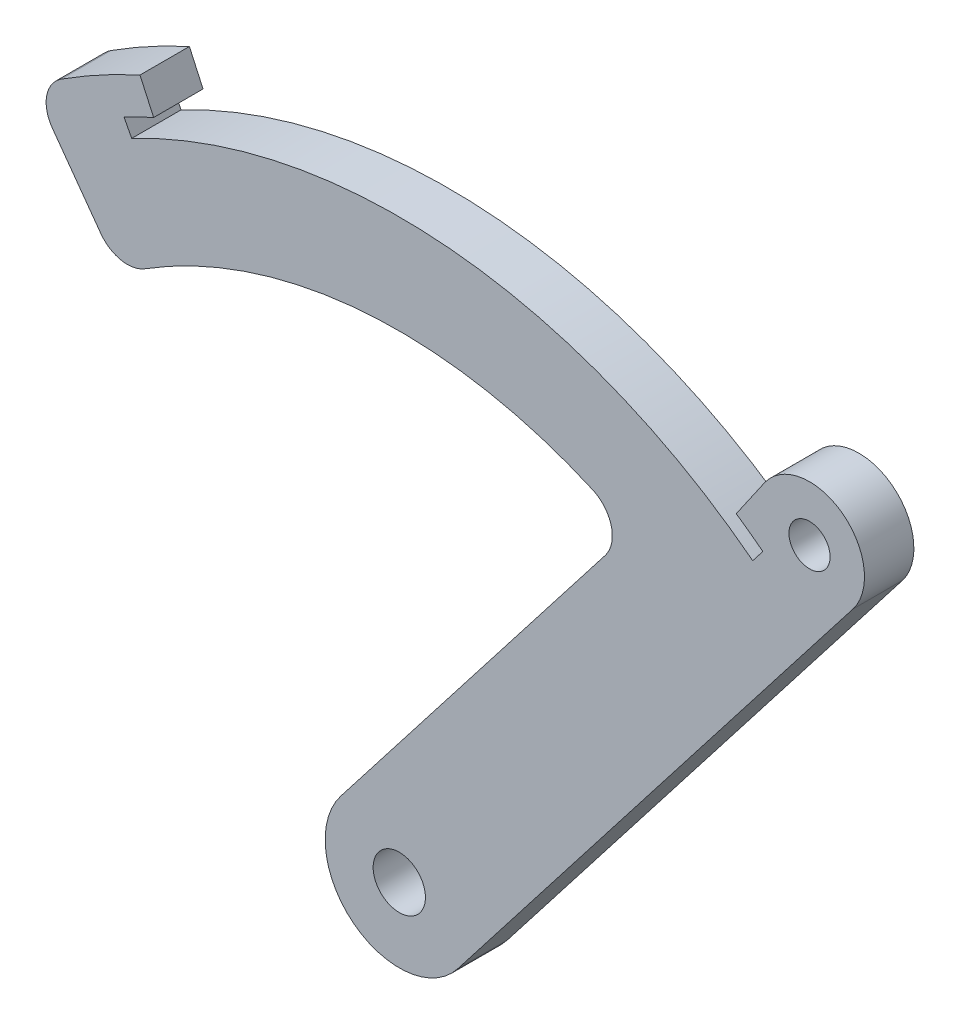
ISO-10303-21;
HEADER;
FILE_DESCRIPTION(('STEP AP214'),'2;1');
FILE_NAME('part.step','',(''),(''),'','','');
FILE_SCHEMA(('AUTOMOTIVE_DESIGN { 1 0 10303 214 1 1 1 1 }'));
ENDSEC;
DATA;
#1=APPLICATION_CONTEXT('core data for automotive mechanical design processes');
#2=APPLICATION_PROTOCOL_DEFINITION('international standard','automotive_design',2000,#1);
#3=PRODUCT_CONTEXT('',#1,'mechanical');
#4=PRODUCT('Part','Part','',(#3));
#5=PRODUCT_RELATED_PRODUCT_CATEGORY('part','',(#4));
#6=PRODUCT_DEFINITION_FORMATION('','',#4);
#7=PRODUCT_DEFINITION_CONTEXT('part definition',#1,'design');
#8=PRODUCT_DEFINITION('design','',#6,#7);
#9=PRODUCT_DEFINITION_SHAPE('','',#8);
#10=(LENGTH_UNIT() NAMED_UNIT(*) SI_UNIT(.MILLI.,.METRE.));
#11=(NAMED_UNIT(*) PLANE_ANGLE_UNIT() SI_UNIT($,.RADIAN.));
#12=(NAMED_UNIT(*) SI_UNIT($,.STERADIAN.) SOLID_ANGLE_UNIT());
#13=UNCERTAINTY_MEASURE_WITH_UNIT(LENGTH_MEASURE(1.E-05),#10,'distance_accuracy_value','');
#14=(GEOMETRIC_REPRESENTATION_CONTEXT(3) GLOBAL_UNCERTAINTY_ASSIGNED_CONTEXT((#13)) GLOBAL_UNIT_ASSIGNED_CONTEXT((#10,
#11,#12)) REPRESENTATION_CONTEXT('',''));
#15=CARTESIAN_POINT('',(0.,0.,0.));
#16=DIRECTION('',(0.,0.,1.));
#17=DIRECTION('',(1.,0.,0.));
#18=AXIS2_PLACEMENT_3D('',#15,#16,#17);
#19=CARTESIAN_POINT('',(-42.5000000000004,165.341310921622,-2.99999999999986));
#20=DIRECTION('',(0.,0.,1.));
#21=DIRECTION('',(1.,0.,0.));
#22=AXIS2_PLACEMENT_3D('',#19,#20,#21);
#23=CYLINDRICAL_SURFACE('',#22,35.);
#24=CARTESIAN_POINT('',(-42.5000000000004,165.341310921622,0.));
#25=DIRECTION('',(0.,0.,1.));
#26=DIRECTION('',(-1.,0.,0.));
#27=AXIS2_PLACEMENT_3D('',#24,#25,#26);
#28=CIRCLE('',#27,35.);
#29=CARTESIAN_POINT('',(-21.038388074973,192.989081420878,0.));
#30=VERTEX_POINT('',#29);
#31=CARTESIAN_POINT('',(-58.7480768092723,196.341310921622,0.));
#32=VERTEX_POINT('',#31);
#33=EDGE_CURVE('E182',#30,#32,#28,.T.);
#34=ORIENTED_EDGE('',*,*,#33,.F.);
#35=DIRECTION('',(0.,0.,1.));
#36=VECTOR('',#35,1.);
#37=CARTESIAN_POINT('',(-21.038388074973,192.989081420878,-2.99999999999986));
#38=LINE('',#37,#36);
#39=CARTESIAN_POINT('',(-21.038388074973,192.989081420878,-2.99999999999986));
#40=VERTEX_POINT('',#39);
#41=EDGE_CURVE('E11',#40,#30,#38,.T.);
#42=ORIENTED_EDGE('',*,*,#41,.F.);
#43=CARTESIAN_POINT('',(-42.5000000000004,165.341310921622,-2.99999999999986));
#44=DIRECTION('',(0.,0.,1.));
#45=DIRECTION('',(-1.,0.,0.));
#46=AXIS2_PLACEMENT_3D('',#43,#44,#45);
#47=CIRCLE('',#46,35.);
#48=CARTESIAN_POINT('',(-58.7480768092723,196.341310921622,-2.99999999999986));
#49=VERTEX_POINT('',#48);
#50=EDGE_CURVE('E230',#40,#49,#47,.T.);
#51=ORIENTED_EDGE('',*,*,#50,.T.);
#52=DIRECTION('',(0.,0.,1.));
#53=VECTOR('',#52,1.);
#54=CARTESIAN_POINT('',(-58.7480768092723,196.341310921622,-2.99999999999986));
#55=LINE('',#54,#53);
#56=EDGE_CURVE('E34',#49,#32,#55,.T.);
#57=ORIENTED_EDGE('',*,*,#56,.T.);
#58=EDGE_LOOP('',(#34,#42,#51,#57));
#59=FACE_BOUND('',#58,.T.);
#60=ADVANCED_FACE('F31',(#59),#23,.T.);
#61=CARTESIAN_POINT('',(-21.038388074973,192.989081420878,-2.99999999999986));
#62=DIRECTION('',(-0.78993629997874,0.613188912143638,0.));
#63=DIRECTION('',(-0.613188912143638,-0.78993629997874,0.));
#64=AXIS2_PLACEMENT_3D('',#61,#62,#63);
#65=PLANE('',#64);
#66=DIRECTION('',(-0.613188912143638,-0.78993629997874,0.));
#67=VECTOR('',#66,1.);
#68=CARTESIAN_POINT('',(-21.038388074973,192.989081420878,0.));
#69=LINE('',#68,#67);
#70=CARTESIAN_POINT('',(-20.4251991628294,193.779017720856,0.));
#71=VERTEX_POINT('',#70);
#72=EDGE_CURVE('E228',#71,#30,#69,.T.);
#73=ORIENTED_EDGE('',*,*,#72,.F.);
#74=DIRECTION('',(0.,0.,1.));
#75=VECTOR('',#74,1.);
#76=CARTESIAN_POINT('',(-20.4251991628294,193.779017720856,-2.99999999999986));
#77=LINE('',#76,#75);
#78=CARTESIAN_POINT('',(-20.4251991628294,193.779017720856,-2.99999999999986));
#79=VERTEX_POINT('',#78);
#80=EDGE_CURVE('E40',#79,#71,#77,.T.);
#81=ORIENTED_EDGE('',*,*,#80,.F.);
#82=DIRECTION('',(-0.613188912143638,-0.78993629997874,0.));
#83=VECTOR('',#82,1.);
#84=CARTESIAN_POINT('',(-21.038388074973,192.989081420878,-2.99999999999986));
#85=LINE('',#84,#83);
#86=EDGE_CURVE('E172',#79,#40,#85,.T.);
#87=ORIENTED_EDGE('',*,*,#86,.T.);
#88=ORIENTED_EDGE('',*,*,#41,.T.);
#89=EDGE_LOOP('',(#73,#81,#87,#88));
#90=FACE_BOUND('',#89,.T.);
#91=ADVANCED_FACE('F260',(#90),#65,.T.);
#92=CARTESIAN_POINT('',(-42.5000000000004,165.341310921622,-2.99999999999986));
#93=DIRECTION('',(0.,0.,1.));
#94=DIRECTION('',(1.,0.,0.));
#95=AXIS2_PLACEMENT_3D('',#92,#93,#94);
#96=CYLINDRICAL_SURFACE('',#95,36.);
#97=CARTESIAN_POINT('',(-42.5000000000004,165.341310921622,0.));
#98=DIRECTION('',(0.,0.,-1.));
#99=DIRECTION('',(1.,0.,0.));
#100=AXIS2_PLACEMENT_3D('',#97,#98,#99);
#101=CIRCLE('',#100,36.);
#102=CARTESIAN_POINT('',(-22.0385281770893,194.961036964248,0.));
#103=VERTEX_POINT('',#102);
#104=EDGE_CURVE('E159',#103,#71,#101,.T.);
#105=ORIENTED_EDGE('',*,*,#104,.F.);
#106=DIRECTION('',(0.,0.,1.));
#107=VECTOR('',#106,1.);
#108=CARTESIAN_POINT('',(-22.0385281770893,194.961036964248,-2.99999999999986));
#109=LINE('',#108,#107);
#110=CARTESIAN_POINT('',(-22.0385281770893,194.961036964248,-2.99999999999986));
#111=VERTEX_POINT('',#110);
#112=EDGE_CURVE('E154',#111,#103,#109,.T.);
#113=ORIENTED_EDGE('',*,*,#112,.F.);
#114=CARTESIAN_POINT('',(-42.5000000000004,165.341310921622,-2.99999999999986));
#115=DIRECTION('',(0.,0.,-1.));
#116=DIRECTION('',(1.,0.,0.));
#117=AXIS2_PLACEMENT_3D('',#114,#115,#116);
#118=CIRCLE('',#117,36.);
#119=EDGE_CURVE('E157',#111,#79,#118,.T.);
#120=ORIENTED_EDGE('',*,*,#119,.T.);
#121=ORIENTED_EDGE('',*,*,#80,.T.);
#122=EDGE_LOOP('',(#105,#113,#120,#121));
#123=FACE_BOUND('',#122,.T.);
#124=ADVANCED_FACE('F156',(#123),#96,.F.);
#125=CARTESIAN_POINT('',(-22.0385281770893,194.961036964248,-2.99999999999986));
#126=DIRECTION('',(-0.822770167850722,0.568374217303086,0.));
#127=DIRECTION('',(-0.568374217303086,-0.822770167850722,0.));
#128=AXIS2_PLACEMENT_3D('',#125,#126,#127);
#129=PLANE('',#128);
#130=DIRECTION('',(-0.568374217303086,-0.822770167850722,0.));
#131=VECTOR('',#130,1.);
#132=CARTESIAN_POINT('',(-22.0385281770893,194.961036964248,0.));
#133=LINE('',#132,#131);
#134=CARTESIAN_POINT('',(-20.33340552518,197.4293474678,0.));
#135=VERTEX_POINT('',#134);
#136=EDGE_CURVE('E225',#135,#103,#133,.T.);
#137=ORIENTED_EDGE('',*,*,#136,.F.);
#138=DIRECTION('',(0.,0.,1.));
#139=VECTOR('',#138,1.);
#140=CARTESIAN_POINT('',(-20.33340552518,197.4293474678,-2.99999999999986));
#141=LINE('',#140,#139);
#142=CARTESIAN_POINT('',(-20.33340552518,197.4293474678,-2.99999999999986));
#143=VERTEX_POINT('',#142);
#144=EDGE_CURVE('E164',#143,#135,#141,.T.);
#145=ORIENTED_EDGE('',*,*,#144,.F.);
#146=DIRECTION('',(-0.568374217303086,-0.822770167850722,0.));
#147=VECTOR('',#146,1.);
#148=CARTESIAN_POINT('',(-22.0385281770893,194.961036964248,-2.99999999999986));
#149=LINE('',#148,#147);
#150=EDGE_CURVE('E170',#143,#111,#149,.T.);
#151=ORIENTED_EDGE('',*,*,#150,.T.);
#152=ORIENTED_EDGE('',*,*,#112,.T.);
#153=EDGE_LOOP('',(#137,#145,#151,#152));
#154=FACE_BOUND('',#153,.T.);
#155=ADVANCED_FACE('F174',(#154),#129,.T.);
#156=CARTESIAN_POINT('',(-17.5890646974287,195.533541529599,-2.99999999999986));
#157=DIRECTION('',(0.,0.,1.));
#158=DIRECTION('',(1.,0.,0.));
#159=AXIS2_PLACEMENT_3D('',#156,#157,#158);
#160=CYLINDRICAL_SURFACE('',#159,3.33548897977206);
#161=CARTESIAN_POINT('',(-17.5890646974287,195.533541529599,0.));
#162=DIRECTION('',(0.,0.,1.));
#163=DIRECTION('',(1.,0.,0.));
#164=AXIS2_PLACEMENT_3D('',#161,#162,#163);
#165=CIRCLE('',#164,3.33548897977206);
#166=CARTESIAN_POINT('',(-14.9542408741277,193.488256670625,0.));
#167=VERTEX_POINT('',#166);
#168=EDGE_CURVE('E222',#167,#135,#165,.T.);
#169=ORIENTED_EDGE('',*,*,#168,.F.);
#170=DIRECTION('',(0.,0.,1.));
#171=VECTOR('',#170,1.);
#172=CARTESIAN_POINT('',(-14.9542408741277,193.488256670625,-2.99999999999986));
#173=LINE('',#172,#171);
#174=CARTESIAN_POINT('',(-14.9542408741277,193.488256670625,-2.99999999999986));
#175=VERTEX_POINT('',#174);
#176=EDGE_CURVE('E234',#175,#167,#173,.T.);
#177=ORIENTED_EDGE('',*,*,#176,.F.);
#178=CARTESIAN_POINT('',(-17.5890646974287,195.533541529599,-2.99999999999986));
#179=DIRECTION('',(0.,0.,1.));
#180=DIRECTION('',(1.,0.,0.));
#181=AXIS2_PLACEMENT_3D('',#178,#179,#180);
#182=CIRCLE('',#181,3.33548897977206);
#183=EDGE_CURVE('E175',#175,#143,#182,.T.);
#184=ORIENTED_EDGE('',*,*,#183,.T.);
#185=ORIENTED_EDGE('',*,*,#144,.T.);
#186=EDGE_LOOP('',(#169,#177,#184,#185));
#187=FACE_BOUND('',#186,.T.);
#188=ADVANCED_FACE('F273',(#187),#160,.T.);
#189=CARTESIAN_POINT('',(-14.9542408741277,193.488256670625,-2.99999999999986));
#190=DIRECTION('',(0.78993629997874,-0.613188912143639,0.));
#191=DIRECTION('',(0.613188912143638,0.789936299978739,0.));
#192=AXIS2_PLACEMENT_3D('',#189,#190,#191);
#193=PLANE('',#192);
#194=DIRECTION('',(0.613188912143638,0.789936299978739,0.));
#195=VECTOR('',#194,1.);
#196=CARTESIAN_POINT('',(-14.9542408741277,193.488256670625,0.));
#197=LINE('',#196,#195);
#198=CARTESIAN_POINT('',(-38.9452866500961,162.581960816975,0.));
#199=VERTEX_POINT('',#198);
#200=EDGE_CURVE('E219',#199,#167,#197,.T.);
#201=ORIENTED_EDGE('',*,*,#200,.F.);
#202=DIRECTION('',(0.,0.,1.));
#203=VECTOR('',#202,1.);
#204=CARTESIAN_POINT('',(-38.9452866500961,162.581960816975,-2.99999999999986));
#205=LINE('',#204,#203);
#206=CARTESIAN_POINT('',(-38.9452866500961,162.581960816975,-2.99999999999986));
#207=VERTEX_POINT('',#206);
#208=EDGE_CURVE('E236',#207,#199,#205,.T.);
#209=ORIENTED_EDGE('',*,*,#208,.F.);
#210=DIRECTION('',(0.613188912143638,0.789936299978739,0.));
#211=VECTOR('',#210,1.);
#212=CARTESIAN_POINT('',(-14.9542408741277,193.488256670625,-2.99999999999986));
#213=LINE('',#212,#211);
#214=EDGE_CURVE('E177',#207,#175,#213,.T.);
#215=ORIENTED_EDGE('',*,*,#214,.T.);
#216=ORIENTED_EDGE('',*,*,#176,.T.);
#217=EDGE_LOOP('',(#201,#209,#215,#216));
#218=FACE_BOUND('',#217,.T.);
#219=ADVANCED_FACE('F276',(#218),#193,.T.);
#220=CARTESIAN_POINT('',(-42.5000000000004,165.341310921622,-2.99999999999986));
#221=DIRECTION('',(0.,0.,1.));
#222=DIRECTION('',(1.,0.,0.));
#223=AXIS2_PLACEMENT_3D('',#220,#221,#222);
#224=CYLINDRICAL_SURFACE('',#223,4.49999999999999);
#225=CARTESIAN_POINT('',(-42.5000000000004,165.341310921622,0.));
#226=DIRECTION('',(0.,0.,1.));
#227=DIRECTION('',(-1.,0.,0.));
#228=AXIS2_PLACEMENT_3D('',#225,#226,#227);
#229=CIRCLE('',#228,4.49999999999999);
#230=CARTESIAN_POINT('',(-46.0547133499047,168.100661026268,0.));
#231=VERTEX_POINT('',#230);
#232=EDGE_CURVE('E216',#231,#199,#229,.T.);
#233=ORIENTED_EDGE('',*,*,#232,.F.);
#234=DIRECTION('',(0.,0.,1.));
#235=VECTOR('',#234,1.);
#236=CARTESIAN_POINT('',(-46.0547133499047,168.100661026268,-2.99999999999986));
#237=LINE('',#236,#235);
#238=CARTESIAN_POINT('',(-46.0547133499047,168.100661026268,-2.99999999999986));
#239=VERTEX_POINT('',#238);
#240=EDGE_CURVE('E238',#239,#231,#237,.T.);
#241=ORIENTED_EDGE('',*,*,#240,.F.);
#242=CARTESIAN_POINT('',(-42.5000000000004,165.341310921622,-2.99999999999986));
#243=DIRECTION('',(0.,0.,1.));
#244=DIRECTION('',(-1.,0.,0.));
#245=AXIS2_PLACEMENT_3D('',#242,#243,#244);
#246=CIRCLE('',#245,4.49999999999999);
#247=EDGE_CURVE('E385',#239,#207,#246,.T.);
#248=ORIENTED_EDGE('',*,*,#247,.T.);
#249=ORIENTED_EDGE('',*,*,#208,.T.);
#250=EDGE_LOOP('',(#233,#241,#248,#249));
#251=FACE_BOUND('',#250,.T.);
#252=ADVANCED_FACE('F280',(#251),#224,.T.);
#253=CARTESIAN_POINT('',(-46.0547133499047,168.100661026268,-2.99999999999986));
#254=DIRECTION('',(-0.78993629997874,0.613188912143638,0.));
#255=DIRECTION('',(-0.613188912143638,-0.78993629997874,0.));
#256=AXIS2_PLACEMENT_3D('',#253,#254,#255);
#257=PLANE('',#256);
#258=DIRECTION('',(-0.613188912143638,-0.78993629997874,0.));
#259=VECTOR('',#258,1.);
#260=CARTESIAN_POINT('',(-46.0547133499047,168.100661026268,0.));
#261=LINE('',#260,#259);
#262=CARTESIAN_POINT('',(-29.9855366168873,188.801664845481,0.));
#263=VERTEX_POINT('',#262);
#264=EDGE_CURVE('E213',#263,#231,#261,.T.);
#265=ORIENTED_EDGE('',*,*,#264,.F.);
#266=DIRECTION('',(0.,0.,1.));
#267=VECTOR('',#266,1.);
#268=CARTESIAN_POINT('',(-29.9855366168873,188.801664845481,-2.99999999999986));
#269=LINE('',#268,#267);
#270=CARTESIAN_POINT('',(-29.9855366168873,188.801664845481,-2.99999999999986));
#271=VERTEX_POINT('',#270);
#272=EDGE_CURVE('E240',#271,#263,#269,.T.);
#273=ORIENTED_EDGE('',*,*,#272,.F.);
#274=DIRECTION('',(-0.613188912143638,-0.78993629997874,0.));
#275=VECTOR('',#274,1.);
#276=CARTESIAN_POINT('',(-46.0547133499047,168.100661026268,-2.99999999999986));
#277=LINE('',#276,#275);
#278=EDGE_CURVE('E382',#271,#239,#277,.T.);
#279=ORIENTED_EDGE('',*,*,#278,.T.);
#280=ORIENTED_EDGE('',*,*,#240,.T.);
#281=EDGE_LOOP('',(#265,#273,#279,#280));
#282=FACE_BOUND('',#281,.T.);
#283=ADVANCED_FACE('F284',(#282),#257,.T.);
#284=CARTESIAN_POINT('',(-31.5654092168448,190.028042669768,-2.99999999999986));
#285=DIRECTION('',(0.,0.,1.));
#286=DIRECTION('',(1.,0.,0.));
#287=AXIS2_PLACEMENT_3D('',#284,#285,#286);
#288=CYLINDRICAL_SURFACE('',#287,2.);
#289=CARTESIAN_POINT('',(-31.5654092168448,190.028042669768,0.));
#290=DIRECTION('',(0.,0.,-1.));
#291=DIRECTION('',(1.,0.,0.));
#292=AXIS2_PLACEMENT_3D('',#289,#290,#291);
#293=CIRCLE('',#292,2.);
#294=CARTESIAN_POINT('',(-30.7554395292036,191.856689465927,0.));
#295=VERTEX_POINT('',#294);
#296=EDGE_CURVE('E210',#295,#263,#293,.T.);
#297=ORIENTED_EDGE('',*,*,#296,.F.);
#298=DIRECTION('',(0.,0.,1.));
#299=VECTOR('',#298,1.);
#300=CARTESIAN_POINT('',(-30.7554395292036,191.856689465927,-2.99999999999986));
#301=LINE('',#300,#299);
#302=CARTESIAN_POINT('',(-30.7554395292036,191.856689465927,-2.99999999999986));
#303=VERTEX_POINT('',#302);
#304=EDGE_CURVE('E242',#303,#295,#301,.T.);
#305=ORIENTED_EDGE('',*,*,#304,.F.);
#306=CARTESIAN_POINT('',(-31.5654092168448,190.028042669768,-2.99999999999986));
#307=DIRECTION('',(0.,0.,-1.));
#308=DIRECTION('',(1.,0.,0.));
#309=AXIS2_PLACEMENT_3D('',#306,#307,#308);
#310=CIRCLE('',#309,2.);
#311=EDGE_CURVE('E379',#303,#271,#310,.T.);
#312=ORIENTED_EDGE('',*,*,#311,.T.);
#313=ORIENTED_EDGE('',*,*,#272,.T.);
#314=EDGE_LOOP('',(#297,#305,#312,#313));
#315=FACE_BOUND('',#314,.T.);
#316=ADVANCED_FACE('F288',(#315),#288,.F.);
#317=CARTESIAN_POINT('',(-42.5000000000004,165.341310921622,-2.99999999999986));
#318=DIRECTION('',(0.,0.,1.));
#319=DIRECTION('',(1.,0.,0.));
#320=AXIS2_PLACEMENT_3D('',#317,#318,#319);
#321=CYLINDRICAL_SURFACE('',#320,29.);
#322=CARTESIAN_POINT('',(-42.5000000000004,165.341310921622,0.));
#323=DIRECTION('',(0.,0.,-1.));
#324=DIRECTION('',(1.,0.,0.));
#325=AXIS2_PLACEMENT_3D('',#322,#323,#324);
#326=CIRCLE('',#325,29.);
#327=CARTESIAN_POINT('',(-57.9425272657947,189.887763855706,0.));
#328=VERTEX_POINT('',#327);
#329=EDGE_CURVE('E207',#328,#295,#326,.T.);
#330=ORIENTED_EDGE('',*,*,#329,.F.);
#331=DIRECTION('',(0.,0.,1.));
#332=VECTOR('',#331,1.);
#333=CARTESIAN_POINT('',(-57.9425272657947,189.887763855706,-2.99999999999986));
#334=LINE('',#333,#332);
#335=CARTESIAN_POINT('',(-57.9425272657947,189.887763855706,-2.99999999999986));
#336=VERTEX_POINT('',#335);
#337=EDGE_CURVE('E244',#336,#328,#334,.T.);
#338=ORIENTED_EDGE('',*,*,#337,.F.);
#339=CARTESIAN_POINT('',(-42.5000000000004,165.341310921622,-2.99999999999986));
#340=DIRECTION('',(0.,0.,-1.));
#341=DIRECTION('',(1.,0.,0.));
#342=AXIS2_PLACEMENT_3D('',#339,#340,#341);
#343=CIRCLE('',#342,29.);
#344=EDGE_CURVE('E376',#336,#303,#343,.T.);
#345=ORIENTED_EDGE('',*,*,#344,.T.);
#346=ORIENTED_EDGE('',*,*,#304,.T.);
#347=EDGE_LOOP('',(#330,#338,#345,#346));
#348=FACE_BOUND('',#347,.T.);
#349=ADVANCED_FACE('F292',(#348),#321,.F.);
#350=CARTESIAN_POINT('',(-59.0075291461943,191.580622678746,-2.99999999999986));
#351=DIRECTION('',(0.,0.,1.));
#352=DIRECTION('',(1.,0.,0.));
#353=AXIS2_PLACEMENT_3D('',#350,#351,#352);
#354=CYLINDRICAL_SURFACE('',#353,2.);
#355=CARTESIAN_POINT('',(-59.0075291461943,191.580622678746,0.));
#356=DIRECTION('',(0.,0.,1.));
#357=DIRECTION('',(1.,0.,0.));
#358=AXIS2_PLACEMENT_3D('',#355,#356,#357);
#359=CIRCLE('',#358,2.);
#360=CARTESIAN_POINT('',(-60.6281513774536,190.408622856413,0.));
#361=VERTEX_POINT('',#360);
#362=EDGE_CURVE('E204',#361,#328,#359,.T.);
#363=ORIENTED_EDGE('',*,*,#362,.F.);
#364=DIRECTION('',(0.,0.,1.));
#365=VECTOR('',#364,1.);
#366=CARTESIAN_POINT('',(-60.6281513774536,190.408622856413,-2.99999999999986));
#367=LINE('',#366,#365);
#368=CARTESIAN_POINT('',(-60.6281513774536,190.408622856413,-2.99999999999986));
#369=VERTEX_POINT('',#368);
#370=EDGE_CURVE('E246',#369,#361,#367,.T.);
#371=ORIENTED_EDGE('',*,*,#370,.F.);
#372=CARTESIAN_POINT('',(-59.0075291461943,191.580622678746,-2.99999999999986));
#373=DIRECTION('',(0.,0.,1.));
#374=DIRECTION('',(1.,0.,0.));
#375=AXIS2_PLACEMENT_3D('',#372,#373,#374);
#376=CIRCLE('',#375,2.);
#377=EDGE_CURVE('E373',#369,#336,#376,.T.);
#378=ORIENTED_EDGE('',*,*,#377,.T.);
#379=ORIENTED_EDGE('',*,*,#337,.T.);
#380=EDGE_LOOP('',(#363,#371,#378,#379));
#381=FACE_BOUND('',#380,.T.);
#382=ADVANCED_FACE('F296',(#381),#354,.T.);
#383=CARTESIAN_POINT('',(-63.5634160925056,194.467459010821,-2.99999999999986));
#384=DIRECTION('',(-0.810311115629668,-0.585999911166377,0.));
#385=DIRECTION('',(0.585999911166377,-0.810311115629669,0.));
#386=AXIS2_PLACEMENT_3D('',#383,#384,#385);
#387=PLANE('',#386);
#388=DIRECTION('',(0.585999911166377,-0.810311115629669,0.));
#389=VECTOR('',#388,1.);
#390=CARTESIAN_POINT('',(-63.5634160925056,194.467459010821,0.));
#391=LINE('',#390,#389);
#392=CARTESIAN_POINT('',(-63.5634160925056,194.467459010821,0.));
#393=VERTEX_POINT('',#392);
#394=EDGE_CURVE('E201',#393,#361,#391,.T.);
#395=ORIENTED_EDGE('',*,*,#394,.F.);
#396=DIRECTION('',(0.,0.,1.));
#397=VECTOR('',#396,1.);
#398=CARTESIAN_POINT('',(-63.5634160925056,194.467459010821,-2.99999999999986));
#399=LINE('',#398,#397);
#400=CARTESIAN_POINT('',(-63.5634160925056,194.467459010821,-2.99999999999986));
#401=VERTEX_POINT('',#400);
#402=EDGE_CURVE('E248',#401,#393,#399,.T.);
#403=ORIENTED_EDGE('',*,*,#402,.F.);
#404=DIRECTION('',(0.585999911166377,-0.810311115629669,0.));
#405=VECTOR('',#404,1.);
#406=CARTESIAN_POINT('',(-63.5634160925056,194.467459010821,-2.99999999999986));
#407=LINE('',#406,#405);
#408=EDGE_CURVE('E370',#401,#369,#407,.T.);
#409=ORIENTED_EDGE('',*,*,#408,.T.);
#410=ORIENTED_EDGE('',*,*,#370,.T.);
#411=EDGE_LOOP('',(#395,#403,#409,#410));
#412=FACE_BOUND('',#411,.T.);
#413=ADVANCED_FACE('F300',(#412),#387,.T.);
#414=CARTESIAN_POINT('',(-61.9427938612462,195.639458833154,-2.99999999999986));
#415=DIRECTION('',(0.,0.,1.));
#416=DIRECTION('',(1.,0.,0.));
#417=AXIS2_PLACEMENT_3D('',#414,#415,#416);
#418=CYLINDRICAL_SURFACE('',#417,2.00000000000001);
#419=CARTESIAN_POINT('',(-61.9427938612462,195.639458833154,0.));
#420=DIRECTION('',(0.,0.,1.));
#421=DIRECTION('',(-1.,0.,0.));
#422=AXIS2_PLACEMENT_3D('',#419,#420,#421);
#423=CIRCLE('',#422,2.00000000000001);
#424=CARTESIAN_POINT('',(-63.0229490757599,197.322689272684,0.));
#425=VERTEX_POINT('',#424);
#426=EDGE_CURVE('E198',#425,#393,#423,.T.);
#427=ORIENTED_EDGE('',*,*,#426,.F.);
#428=DIRECTION('',(0.,0.,1.));
#429=VECTOR('',#428,1.);
#430=CARTESIAN_POINT('',(-63.0229490757599,197.322689272684,-2.99999999999986));
#431=LINE('',#430,#429);
#432=CARTESIAN_POINT('',(-63.0229490757599,197.322689272684,-2.99999999999986));
#433=VERTEX_POINT('',#432);
#434=EDGE_CURVE('E250',#433,#425,#431,.T.);
#435=ORIENTED_EDGE('',*,*,#434,.F.);
#436=CARTESIAN_POINT('',(-61.9427938612462,195.639458833154,-2.99999999999986));
#437=DIRECTION('',(0.,0.,1.));
#438=DIRECTION('',(-1.,0.,0.));
#439=AXIS2_PLACEMENT_3D('',#436,#437,#438);
#440=CIRCLE('',#439,2.00000000000001);
#441=EDGE_CURVE('E367',#433,#401,#440,.T.);
#442=ORIENTED_EDGE('',*,*,#441,.T.);
#443=ORIENTED_EDGE('',*,*,#402,.T.);
#444=EDGE_LOOP('',(#427,#435,#442,#443));
#445=FACE_BOUND('',#444,.T.);
#446=ADVANCED_FACE('F304',(#445),#418,.T.);
#447=CARTESIAN_POINT('',(-42.5000000000004,165.341310921622,-2.99999999999986));
#448=DIRECTION('',(0.,0.,1.));
#449=DIRECTION('',(1.,0.,0.));
#450=AXIS2_PLACEMENT_3D('',#447,#448,#449);
#451=CYLINDRICAL_SURFACE('',#450,38.);
#452=CARTESIAN_POINT('',(-42.5000000000004,165.341310921622,0.));
#453=DIRECTION('',(0.,0.,1.));
#454=DIRECTION('',(-1.,0.,0.));
#455=AXIS2_PLACEMENT_3D('',#452,#453,#454);
#456=CIRCLE('',#455,38.);
#457=CARTESIAN_POINT('',(-58.244425956842,199.9261782958,0.));
#458=VERTEX_POINT('',#457);
#459=EDGE_CURVE('E195',#458,#425,#456,.T.);
#460=ORIENTED_EDGE('',*,*,#459,.F.);
#461=DIRECTION('',(0.,0.,1.));
#462=VECTOR('',#461,1.);
#463=CARTESIAN_POINT('',(-58.244425956842,199.9261782958,-2.99999999999986));
#464=LINE('',#463,#462);
#465=CARTESIAN_POINT('',(-58.244425956842,199.9261782958,-2.99999999999986));
#466=VERTEX_POINT('',#465);
#467=EDGE_CURVE('E252',#466,#458,#464,.T.);
#468=ORIENTED_EDGE('',*,*,#467,.F.);
#469=CARTESIAN_POINT('',(-42.5000000000004,165.341310921622,-2.99999999999986));
#470=DIRECTION('',(0.,0.,1.));
#471=DIRECTION('',(-1.,0.,0.));
#472=AXIS2_PLACEMENT_3D('',#469,#470,#471);
#473=CIRCLE('',#472,38.);
#474=EDGE_CURVE('E364',#466,#433,#473,.T.);
#475=ORIENTED_EDGE('',*,*,#474,.T.);
#476=ORIENTED_EDGE('',*,*,#434,.T.);
#477=EDGE_LOOP('',(#460,#468,#475,#476));
#478=FACE_BOUND('',#477,.T.);
#479=ADVANCED_FACE('F308',(#478),#451,.T.);
#480=CARTESIAN_POINT('',(-57.4157719591134,198.105922118212,-2.99999999999986));
#481=DIRECTION('',(0.910128088794176,0.414326998864255,0.));
#482=DIRECTION('',(-0.414326998864255,0.910128088794176,0.));
#483=AXIS2_PLACEMENT_3D('',#480,#481,#482);
#484=PLANE('',#483);
#485=DIRECTION('',(-0.414326998864255,0.910128088794176,0.));
#486=VECTOR('',#485,1.);
#487=CARTESIAN_POINT('',(-57.4157719591134,198.105922118212,0.));
#488=LINE('',#487,#486);
#489=CARTESIAN_POINT('',(-57.4157719591134,198.105922118212,0.));
#490=VERTEX_POINT('',#489);
#491=EDGE_CURVE('E192',#490,#458,#488,.T.);
#492=ORIENTED_EDGE('',*,*,#491,.F.);
#493=DIRECTION('',(0.,0.,1.));
#494=VECTOR('',#493,1.);
#495=CARTESIAN_POINT('',(-57.4157719591134,198.105922118212,-2.99999999999986));
#496=LINE('',#495,#494);
#497=CARTESIAN_POINT('',(-57.4157719591134,198.105922118212,-2.99999999999986));
#498=VERTEX_POINT('',#497);
#499=EDGE_CURVE('E254',#498,#490,#496,.T.);
#500=ORIENTED_EDGE('',*,*,#499,.F.);
#501=DIRECTION('',(-0.414326998864255,0.910128088794176,0.));
#502=VECTOR('',#501,1.);
#503=CARTESIAN_POINT('',(-57.4157719591134,198.105922118212,-2.99999999999986));
#504=LINE('',#503,#502);
#505=EDGE_CURVE('E361',#498,#466,#504,.T.);
#506=ORIENTED_EDGE('',*,*,#505,.T.);
#507=ORIENTED_EDGE('',*,*,#467,.T.);
#508=EDGE_LOOP('',(#492,#500,#506,#507));
#509=FACE_BOUND('',#508,.T.);
#510=ADVANCED_FACE('F312',(#509),#484,.T.);
#511=CARTESIAN_POINT('',(-42.5000000000004,165.341310921622,-2.99999999999986));
#512=DIRECTION('',(0.,0.,1.));
#513=DIRECTION('',(1.,0.,0.));
#514=AXIS2_PLACEMENT_3D('',#511,#512,#513);
#515=CYLINDRICAL_SURFACE('',#514,36.);
#516=CARTESIAN_POINT('',(-42.5000000000004,165.341310921622,0.));
#517=DIRECTION('',(0.,0.,-1.));
#518=DIRECTION('',(-1.,0.,0.));
#519=AXIS2_PLACEMENT_3D('',#516,#517,#518);
#520=CIRCLE('',#519,36.);
#521=CARTESIAN_POINT('',(-59.2123075752515,197.227025207336,0.));
#522=VERTEX_POINT('',#521);
#523=EDGE_CURVE('E189',#522,#490,#520,.T.);
#524=ORIENTED_EDGE('',*,*,#523,.F.);
#525=DIRECTION('',(0.,0.,1.));
#526=VECTOR('',#525,1.);
#527=CARTESIAN_POINT('',(-59.2123075752515,197.227025207336,-2.99999999999986));
#528=LINE('',#527,#526);
#529=CARTESIAN_POINT('',(-59.2123075752515,197.227025207336,-2.99999999999986));
#530=VERTEX_POINT('',#529);
#531=EDGE_CURVE('E255',#530,#522,#528,.T.);
#532=ORIENTED_EDGE('',*,*,#531,.F.);
#533=CARTESIAN_POINT('',(-42.5000000000004,165.341310921622,-2.99999999999986));
#534=DIRECTION('',(0.,0.,-1.));
#535=DIRECTION('',(-1.,0.,0.));
#536=AXIS2_PLACEMENT_3D('',#533,#534,#535);
#537=CIRCLE('',#536,36.);
#538=EDGE_CURVE('E358',#530,#498,#537,.T.);
#539=ORIENTED_EDGE('',*,*,#538,.T.);
#540=ORIENTED_EDGE('',*,*,#499,.T.);
#541=EDGE_LOOP('',(#524,#532,#539,#540));
#542=FACE_BOUND('',#541,.T.);
#543=ADVANCED_FACE('F316',(#542),#515,.F.);
#544=CARTESIAN_POINT('',(-58.7480768092723,196.341310921622,-2.99999999999986));
#545=DIRECTION('',(0.885714285714287,0.464230765979196,0.));
#546=DIRECTION('',(-0.464230765979196,0.885714285714287,0.));
#547=AXIS2_PLACEMENT_3D('',#544,#545,#546);
#548=PLANE('',#547);
#549=DIRECTION('',(-0.464230765979196,0.885714285714287,0.));
#550=VECTOR('',#549,1.);
#551=CARTESIAN_POINT('',(-58.7480768092723,196.341310921622,0.));
#552=LINE('',#551,#550);
#553=EDGE_CURVE('E185',#32,#522,#552,.T.);
#554=ORIENTED_EDGE('',*,*,#553,.F.);
#555=ORIENTED_EDGE('',*,*,#56,.F.);
#556=DIRECTION('',(-0.464230765979196,0.885714285714287,0.));
#557=VECTOR('',#556,1.);
#558=CARTESIAN_POINT('',(-58.7480768092723,196.341310921622,-2.99999999999986));
#559=LINE('',#558,#557);
#560=EDGE_CURVE('E356',#49,#530,#559,.T.);
#561=ORIENTED_EDGE('',*,*,#560,.T.);
#562=ORIENTED_EDGE('',*,*,#531,.T.);
#563=EDGE_LOOP('',(#554,#555,#561,#562));
#564=FACE_BOUND('',#563,.T.);
#565=ADVANCED_FACE('F257',(#564),#548,.T.);
#566=CARTESIAN_POINT('',(-42.5000000000004,165.341310921622,-2.99999999999986));
#567=DIRECTION('',(0.,0.,-1.));
#568=DIRECTION('',(-1.,0.,0.));
#569=AXIS2_PLACEMENT_3D('',#566,#567,#568);
#570=PLANE('',#569);
#571=CARTESIAN_POINT('',(-17.5890646974287,195.533541529599,-2.99999999999986));
#572=DIRECTION('',(0.,0.,1.));
#573=DIRECTION('',(1.,0.,0.));
#574=AXIS2_PLACEMENT_3D('',#571,#572,#573);
#575=CIRCLE('',#574,1.25);
#576=CARTESIAN_POINT('',(-16.3390646974287,195.533541529599,-2.99999999999986));
#577=VERTEX_POINT('',#576);
#578=EDGE_CURVE('E343',#577,#577,#575,.T.);
#579=ORIENTED_EDGE('',*,*,#578,.T.);
#580=EDGE_LOOP('',(#579));
#581=FACE_BOUND('',#580,.T.);
#582=CARTESIAN_POINT('',(-42.5000000000004,165.341310921622,-2.99999999999986));
#583=DIRECTION('',(0.,0.,1.));
#584=DIRECTION('',(1.,0.,0.));
#585=AXIS2_PLACEMENT_3D('',#582,#583,#584);
#586=CIRCLE('',#585,1.58750000000039);
#587=CARTESIAN_POINT('',(-40.9125,165.341310921622,-2.99999999999986));
#588=VERTEX_POINT('',#587);
#589=EDGE_CURVE('E186',#588,#588,#586,.T.);
#590=ORIENTED_EDGE('',*,*,#589,.T.);
#591=EDGE_LOOP('',(#590));
#592=FACE_BOUND('',#591,.T.);
#593=ORIENTED_EDGE('',*,*,#50,.F.);
#594=ORIENTED_EDGE('',*,*,#86,.F.);
#595=ORIENTED_EDGE('',*,*,#119,.F.);
#596=ORIENTED_EDGE('',*,*,#150,.F.);
#597=ORIENTED_EDGE('',*,*,#183,.F.);
#598=ORIENTED_EDGE('',*,*,#214,.F.);
#599=ORIENTED_EDGE('',*,*,#247,.F.);
#600=ORIENTED_EDGE('',*,*,#278,.F.);
#601=ORIENTED_EDGE('',*,*,#311,.F.);
#602=ORIENTED_EDGE('',*,*,#344,.F.);
#603=ORIENTED_EDGE('',*,*,#377,.F.);
#604=ORIENTED_EDGE('',*,*,#408,.F.);
#605=ORIENTED_EDGE('',*,*,#441,.F.);
#606=ORIENTED_EDGE('',*,*,#474,.F.);
#607=ORIENTED_EDGE('',*,*,#505,.F.);
#608=ORIENTED_EDGE('',*,*,#538,.F.);
#609=ORIENTED_EDGE('',*,*,#560,.F.);
#610=EDGE_LOOP('',(#593,#594,#595,#596,#597,#598,#599,#600,#601,#602,#603,#604,#605,#606,#607,
#608,#609));
#611=FACE_BOUND('',#610,.T.);
#612=ADVANCED_FACE('F168',(#581,#592,#611),#570,.T.);
#613=CARTESIAN_POINT('',(-42.5000000000004,165.341310921622,0.));
#614=DIRECTION('',(0.,0.,-1.));
#615=DIRECTION('',(-1.,0.,0.));
#616=AXIS2_PLACEMENT_3D('',#613,#614,#615);
#617=PLANE('',#616);
#618=CARTESIAN_POINT('',(-17.5890646974287,195.533541529599,0.));
#619=DIRECTION('',(0.,0.,1.));
#620=DIRECTION('',(1.,0.,0.));
#621=AXIS2_PLACEMENT_3D('',#618,#619,#620);
#622=CIRCLE('',#621,1.25);
#623=CARTESIAN_POINT('',(-16.3390646974287,195.533541529599,0.));
#624=VERTEX_POINT('',#623);
#625=EDGE_CURVE('E346',#624,#624,#622,.T.);
#626=ORIENTED_EDGE('',*,*,#625,.F.);
#627=EDGE_LOOP('',(#626));
#628=FACE_BOUND('',#627,.T.);
#629=CARTESIAN_POINT('',(-42.5000000000004,165.341310921622,0.));
#630=DIRECTION('',(0.,0.,1.));
#631=DIRECTION('',(1.,0.,0.));
#632=AXIS2_PLACEMENT_3D('',#629,#630,#631);
#633=CIRCLE('',#632,1.58750000000039);
#634=CARTESIAN_POINT('',(-40.9125,165.341310921622,0.));
#635=VERTEX_POINT('',#634);
#636=EDGE_CURVE('E348',#635,#635,#633,.T.);
#637=ORIENTED_EDGE('',*,*,#636,.F.);
#638=EDGE_LOOP('',(#637));
#639=FACE_BOUND('',#638,.T.);
#640=ORIENTED_EDGE('',*,*,#33,.T.);
#641=ORIENTED_EDGE('',*,*,#553,.T.);
#642=ORIENTED_EDGE('',*,*,#523,.T.);
#643=ORIENTED_EDGE('',*,*,#491,.T.);
#644=ORIENTED_EDGE('',*,*,#459,.T.);
#645=ORIENTED_EDGE('',*,*,#426,.T.);
#646=ORIENTED_EDGE('',*,*,#394,.T.);
#647=ORIENTED_EDGE('',*,*,#362,.T.);
#648=ORIENTED_EDGE('',*,*,#329,.T.);
#649=ORIENTED_EDGE('',*,*,#296,.T.);
#650=ORIENTED_EDGE('',*,*,#264,.T.);
#651=ORIENTED_EDGE('',*,*,#232,.T.);
#652=ORIENTED_EDGE('',*,*,#200,.T.);
#653=ORIENTED_EDGE('',*,*,#168,.T.);
#654=ORIENTED_EDGE('',*,*,#136,.T.);
#655=ORIENTED_EDGE('',*,*,#104,.T.);
#656=ORIENTED_EDGE('',*,*,#72,.T.);
#657=EDGE_LOOP('',(#640,#641,#642,#643,#644,#645,#646,#647,#648,#649,#650,#651,#652,#653,#654,
#655,#656));
#658=FACE_BOUND('',#657,.T.);
#659=ADVANCED_FACE('F259',(#628,#639,#658),#617,.F.);
#660=CARTESIAN_POINT('',(-42.5000000000004,165.341310921622,-2.99999999999986));
#661=DIRECTION('',(0.,0.,1.));
#662=DIRECTION('',(1.,0.,0.));
#663=AXIS2_PLACEMENT_3D('',#660,#661,#662);
#664=CYLINDRICAL_SURFACE('',#663,1.58750000000039);
#665=ORIENTED_EDGE('',*,*,#589,.F.);
#666=EDGE_LOOP('',(#665));
#667=FACE_BOUND('',#666,.T.);
#668=ORIENTED_EDGE('',*,*,#636,.T.);
#669=EDGE_LOOP('',(#668));
#670=FACE_BOUND('',#669,.T.);
#671=ADVANCED_FACE('F328',(#667,#670),#664,.F.);
#672=CARTESIAN_POINT('',(-17.5890646974287,195.533541529599,-2.99999999999986));
#673=DIRECTION('',(0.,0.,1.));
#674=DIRECTION('',(1.,0.,0.));
#675=AXIS2_PLACEMENT_3D('',#672,#673,#674);
#676=CYLINDRICAL_SURFACE('',#675,1.25);
#677=ORIENTED_EDGE('',*,*,#578,.F.);
#678=EDGE_LOOP('',(#677));
#679=FACE_BOUND('',#678,.T.);
#680=ORIENTED_EDGE('',*,*,#625,.T.);
#681=EDGE_LOOP('',(#680));
#682=FACE_BOUND('',#681,.T.);
#683=ADVANCED_FACE('F335',(#679,#682),#676,.F.);
#684=CLOSED_SHELL('',(#60,#91,#124,#155,#188,#219,#252,#283,#316,#349,#382,#413,#446,#479,#510,
#543,#565,#612,#659,#671,#683));
#685=MANIFOLD_SOLID_BREP('B2',#684);
#686=ADVANCED_BREP_SHAPE_REPRESENTATION('',(#18,#685),#14);
#687=SHAPE_DEFINITION_REPRESENTATION(#9,#686);
ENDSEC;
END-ISO-10303-21;
